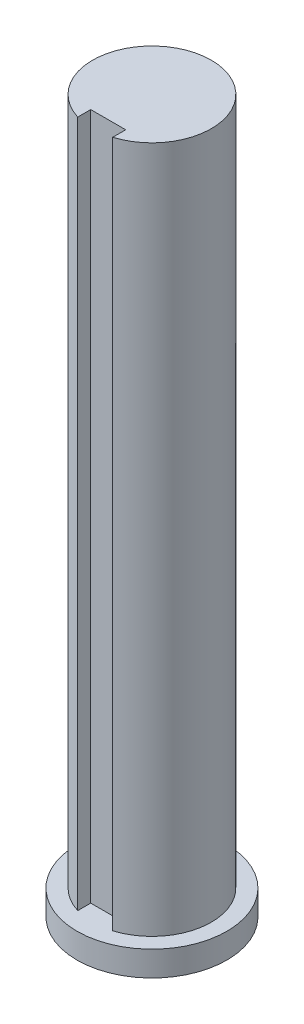
ISO-10303-21;
HEADER;
FILE_DESCRIPTION(('STEP AP214'),'2;1');
FILE_NAME('part.step','',(''),(''),'','','');
FILE_SCHEMA(('AUTOMOTIVE_DESIGN { 1 0 10303 214 1 1 1 1 }'));
ENDSEC;
DATA;
#1=APPLICATION_CONTEXT('core data for automotive mechanical design processes');
#2=APPLICATION_PROTOCOL_DEFINITION('international standard','automotive_design',2000,#1);
#3=PRODUCT_CONTEXT('',#1,'mechanical');
#4=PRODUCT('Part','Part','',(#3));
#5=PRODUCT_RELATED_PRODUCT_CATEGORY('part','',(#4));
#6=PRODUCT_DEFINITION_FORMATION('','',#4);
#7=PRODUCT_DEFINITION_CONTEXT('part definition',#1,'design');
#8=PRODUCT_DEFINITION('design','',#6,#7);
#9=PRODUCT_DEFINITION_SHAPE('','',#8);
#10=(LENGTH_UNIT() NAMED_UNIT(*) SI_UNIT(.MILLI.,.METRE.));
#11=(NAMED_UNIT(*) PLANE_ANGLE_UNIT() SI_UNIT($,.RADIAN.));
#12=(NAMED_UNIT(*) SI_UNIT($,.STERADIAN.) SOLID_ANGLE_UNIT());
#13=UNCERTAINTY_MEASURE_WITH_UNIT(LENGTH_MEASURE(1.E-05),#10,'distance_accuracy_value','');
#14=(GEOMETRIC_REPRESENTATION_CONTEXT(3) GLOBAL_UNCERTAINTY_ASSIGNED_CONTEXT((#13)) GLOBAL_UNIT_ASSIGNED_CONTEXT((#10,
#11,#12)) REPRESENTATION_CONTEXT('',''));
#15=CARTESIAN_POINT('',(0.,0.,0.));
#16=DIRECTION('',(0.,0.,1.));
#17=DIRECTION('',(1.,0.,0.));
#18=AXIS2_PLACEMENT_3D('',#15,#16,#17);
#19=CARTESIAN_POINT('',(0.,2.54,0.));
#20=DIRECTION('',(0.,1.,0.));
#21=DIRECTION('',(0.,0.,1.));
#22=AXIS2_PLACEMENT_3D('',#19,#20,#21);
#23=PLANE('',#22);
#24=CARTESIAN_POINT('',(0.,2.54,0.));
#25=DIRECTION('',(0.,1.,0.));
#26=DIRECTION('',(0.,0.,1.));
#27=AXIS2_PLACEMENT_3D('',#24,#25,#26);
#28=CIRCLE('',#27,7.62);
#29=CARTESIAN_POINT('',(0.,2.54,7.62));
#30=VERTEX_POINT('',#29);
#31=EDGE_CURVE('E11',#30,#30,#28,.T.);
#32=ORIENTED_EDGE('',*,*,#31,.T.);
#33=EDGE_LOOP('',(#32));
#34=FACE_BOUND('',#33,.T.);
#35=CARTESIAN_POINT('',(0.,2.54,0.));
#36=DIRECTION('',(0.,1.,0.));
#37=DIRECTION('',(0.,0.,1.));
#38=AXIS2_PLACEMENT_3D('',#35,#36,#37);
#39=CIRCLE('',#38,6.0325);
#40=CARTESIAN_POINT('',(1.778,2.54,5.76452706212747));
#41=VERTEX_POINT('',#40);
#42=CARTESIAN_POINT('',(-1.778,2.54,5.76452706212747));
#43=VERTEX_POINT('',#42);
#44=EDGE_CURVE('E48',#41,#43,#39,.T.);
#45=ORIENTED_EDGE('',*,*,#44,.F.);
#46=DIRECTION('',(0.,0.,1.));
#47=VECTOR('',#46,1.);
#48=CARTESIAN_POINT('',(1.778,2.54,0.));
#49=LINE('',#48,#47);
#50=CARTESIAN_POINT('',(1.778,2.54,4.445));
#51=VERTEX_POINT('',#50);
#52=EDGE_CURVE('E95',#51,#41,#49,.T.);
#53=ORIENTED_EDGE('',*,*,#52,.F.);
#54=DIRECTION('',(-1.,0.,0.));
#55=VECTOR('',#54,1.);
#56=CARTESIAN_POINT('',(-16.9054213562373,2.54,4.445));
#57=LINE('',#56,#55);
#58=CARTESIAN_POINT('',(-1.778,2.54,4.445));
#59=VERTEX_POINT('',#58);
#60=EDGE_CURVE('E92',#51,#59,#57,.T.);
#61=ORIENTED_EDGE('',*,*,#60,.T.);
#62=DIRECTION('',(0.,0.,1.));
#63=VECTOR('',#62,1.);
#64=CARTESIAN_POINT('',(-1.778,2.54,0.));
#65=LINE('',#64,#63);
#66=EDGE_CURVE('E53',#59,#43,#65,.T.);
#67=ORIENTED_EDGE('',*,*,#66,.T.);
#68=EDGE_LOOP('',(#45,#53,#61,#67));
#69=FACE_BOUND('',#68,.T.);
#70=ADVANCED_FACE('F33',(#34,#69),#23,.T.);
#71=CARTESIAN_POINT('',(0.,2.54,0.));
#72=DIRECTION('',(0.,-1.,0.));
#73=DIRECTION('',(0.,0.,-1.));
#74=AXIS2_PLACEMENT_3D('',#71,#72,#73);
#75=CYLINDRICAL_SURFACE('',#74,7.62);
#76=ORIENTED_EDGE('',*,*,#31,.F.);
#77=EDGE_LOOP('',(#76));
#78=FACE_BOUND('',#77,.T.);
#79=CARTESIAN_POINT('',(0.,0.,0.));
#80=DIRECTION('',(0.,1.,0.));
#81=DIRECTION('',(0.,0.,1.));
#82=AXIS2_PLACEMENT_3D('',#79,#80,#81);
#83=CIRCLE('',#82,7.62);
#84=CARTESIAN_POINT('',(0.,0.,7.62));
#85=VERTEX_POINT('',#84);
#86=EDGE_CURVE('E37',#85,#85,#83,.T.);
#87=ORIENTED_EDGE('',*,*,#86,.T.);
#88=EDGE_LOOP('',(#87));
#89=FACE_BOUND('',#88,.T.);
#90=ADVANCED_FACE('F35',(#78,#89),#75,.T.);
#91=CARTESIAN_POINT('',(0.,0.,0.));
#92=DIRECTION('',(0.,1.,0.));
#93=DIRECTION('',(0.,0.,1.));
#94=AXIS2_PLACEMENT_3D('',#91,#92,#93);
#95=PLANE('',#94);
#96=ORIENTED_EDGE('',*,*,#86,.F.);
#97=EDGE_LOOP('',(#96));
#98=FACE_BOUND('',#97,.T.);
#99=ADVANCED_FACE('F121',(#98),#95,.F.);
#100=CARTESIAN_POINT('',(1.778,72.39,0.));
#101=DIRECTION('',(1.,0.,0.));
#102=DIRECTION('',(0.,0.,-1.));
#103=AXIS2_PLACEMENT_3D('',#100,#101,#102);
#104=PLANE('',#103);
#105=ORIENTED_EDGE('',*,*,#52,.T.);
#106=DIRECTION('',(0.,-1.,0.));
#107=VECTOR('',#106,1.);
#108=CARTESIAN_POINT('',(1.778,72.39,5.76452706212747));
#109=LINE('',#108,#107);
#110=CARTESIAN_POINT('',(1.778,72.39,5.76452706212747));
#111=VERTEX_POINT('',#110);
#112=EDGE_CURVE('E76',#111,#41,#109,.T.);
#113=ORIENTED_EDGE('',*,*,#112,.F.);
#114=DIRECTION('',(0.,0.,1.));
#115=VECTOR('',#114,1.);
#116=CARTESIAN_POINT('',(1.778,72.39,0.));
#117=LINE('',#116,#115);
#118=CARTESIAN_POINT('',(1.778,72.39,4.445));
#119=VERTEX_POINT('',#118);
#120=EDGE_CURVE('E83',#119,#111,#117,.T.);
#121=ORIENTED_EDGE('',*,*,#120,.F.);
#122=DIRECTION('',(0.,-1.,0.));
#123=VECTOR('',#122,1.);
#124=CARTESIAN_POINT('',(1.778,72.39,4.445));
#125=LINE('',#124,#123);
#126=EDGE_CURVE('E103',#119,#51,#125,.T.);
#127=ORIENTED_EDGE('',*,*,#126,.T.);
#128=EDGE_LOOP('',(#105,#113,#121,#127));
#129=FACE_BOUND('',#128,.T.);
#130=ADVANCED_FACE('F94',(#129),#104,.F.);
#131=CARTESIAN_POINT('',(0.,72.39,0.));
#132=DIRECTION('',(0.,-1.,0.));
#133=DIRECTION('',(0.,0.,-1.));
#134=AXIS2_PLACEMENT_3D('',#131,#132,#133);
#135=CYLINDRICAL_SURFACE('',#134,6.0325);
#136=ORIENTED_EDGE('',*,*,#44,.T.);
#137=DIRECTION('',(0.,-1.,0.));
#138=VECTOR('',#137,1.);
#139=CARTESIAN_POINT('',(-1.778,72.39,5.76452706212747));
#140=LINE('',#139,#138);
#141=CARTESIAN_POINT('',(-1.778,72.39,5.76452706212747));
#142=VERTEX_POINT('',#141);
#143=EDGE_CURVE('E78',#142,#43,#140,.T.);
#144=ORIENTED_EDGE('',*,*,#143,.F.);
#145=CARTESIAN_POINT('',(0.,72.39,0.));
#146=DIRECTION('',(0.,1.,0.));
#147=DIRECTION('',(0.,0.,1.));
#148=AXIS2_PLACEMENT_3D('',#145,#146,#147);
#149=CIRCLE('',#148,6.0325);
#150=EDGE_CURVE('E72',#111,#142,#149,.T.);
#151=ORIENTED_EDGE('',*,*,#150,.F.);
#152=ORIENTED_EDGE('',*,*,#112,.T.);
#153=EDGE_LOOP('',(#136,#144,#151,#152));
#154=FACE_BOUND('',#153,.T.);
#155=ADVANCED_FACE('F74',(#154),#135,.T.);
#156=CARTESIAN_POINT('',(-1.778,72.39,0.));
#157=DIRECTION('',(1.,0.,0.));
#158=DIRECTION('',(0.,0.,-1.));
#159=AXIS2_PLACEMENT_3D('',#156,#157,#158);
#160=PLANE('',#159);
#161=ORIENTED_EDGE('',*,*,#66,.F.);
#162=DIRECTION('',(0.,-1.,0.));
#163=VECTOR('',#162,1.);
#164=CARTESIAN_POINT('',(-1.778,72.39,4.445));
#165=LINE('',#164,#163);
#166=CARTESIAN_POINT('',(-1.778,72.39,4.445));
#167=VERTEX_POINT('',#166);
#168=EDGE_CURVE('E98',#167,#59,#165,.T.);
#169=ORIENTED_EDGE('',*,*,#168,.F.);
#170=DIRECTION('',(0.,0.,1.));
#171=VECTOR('',#170,1.);
#172=CARTESIAN_POINT('',(-1.778,72.39,0.));
#173=LINE('',#172,#171);
#174=EDGE_CURVE('E82',#167,#142,#173,.T.);
#175=ORIENTED_EDGE('',*,*,#174,.T.);
#176=ORIENTED_EDGE('',*,*,#143,.T.);
#177=EDGE_LOOP('',(#161,#169,#175,#176));
#178=FACE_BOUND('',#177,.T.);
#179=ADVANCED_FACE('F111',(#178),#160,.T.);
#180=CARTESIAN_POINT('',(-16.9054213562373,72.39,4.445));
#181=DIRECTION('',(0.,0.,1.));
#182=DIRECTION('',(1.,0.,0.));
#183=AXIS2_PLACEMENT_3D('',#180,#181,#182);
#184=PLANE('',#183);
#185=ORIENTED_EDGE('',*,*,#60,.F.);
#186=ORIENTED_EDGE('',*,*,#126,.F.);
#187=DIRECTION('',(-1.,0.,0.));
#188=VECTOR('',#187,1.);
#189=CARTESIAN_POINT('',(-16.9054213562373,72.39,4.445));
#190=LINE('',#189,#188);
#191=EDGE_CURVE('E89',#119,#167,#190,.T.);
#192=ORIENTED_EDGE('',*,*,#191,.T.);
#193=ORIENTED_EDGE('',*,*,#168,.T.);
#194=EDGE_LOOP('',(#185,#186,#192,#193));
#195=FACE_BOUND('',#194,.T.);
#196=ADVANCED_FACE('F114',(#195),#184,.T.);
#197=CARTESIAN_POINT('',(-16.9054213562373,72.39,0.));
#198=DIRECTION('',(0.,1.,0.));
#199=DIRECTION('',(0.,0.,1.));
#200=AXIS2_PLACEMENT_3D('',#197,#198,#199);
#201=PLANE('',#200);
#202=ORIENTED_EDGE('',*,*,#120,.T.);
#203=ORIENTED_EDGE('',*,*,#150,.T.);
#204=ORIENTED_EDGE('',*,*,#174,.F.);
#205=ORIENTED_EDGE('',*,*,#191,.F.);
#206=EDGE_LOOP('',(#202,#203,#204,#205));
#207=FACE_BOUND('',#206,.T.);
#208=ADVANCED_FACE('F87',(#207),#201,.T.);
#209=CLOSED_SHELL('',(#70,#90,#99,#130,#155,#179,#196,#208));
#210=MANIFOLD_SOLID_BREP('B2',#209);
#211=ADVANCED_BREP_SHAPE_REPRESENTATION('',(#18,#210),#14);
#212=SHAPE_DEFINITION_REPRESENTATION(#9,#211);
ENDSEC;
END-ISO-10303-21;
